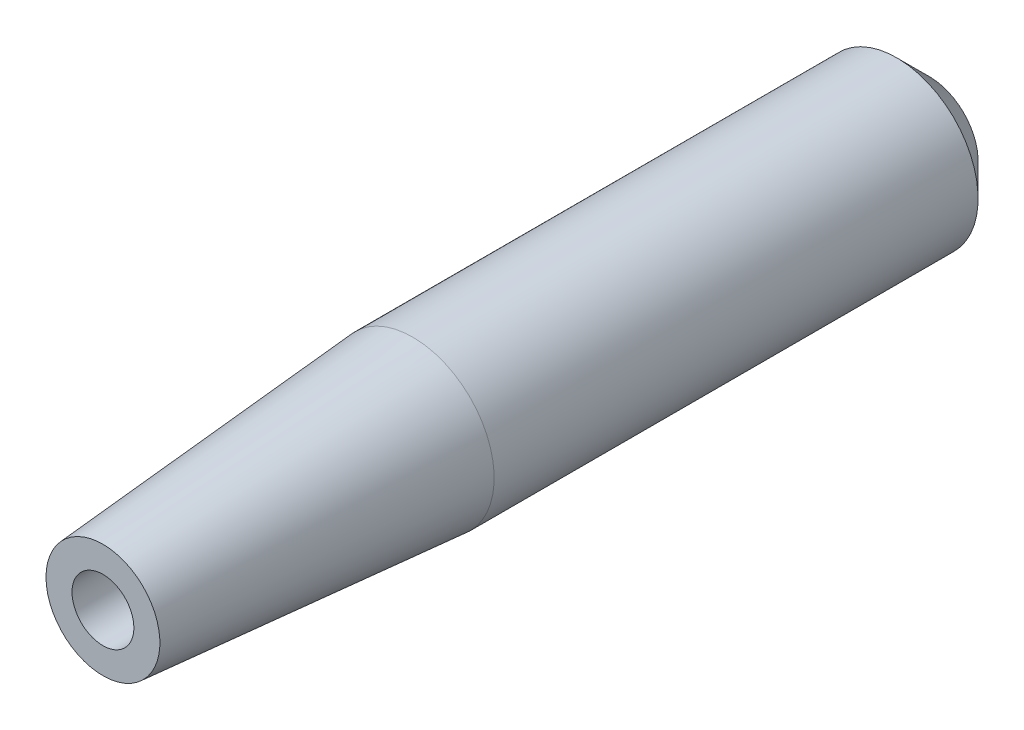
ISO-10303-21;
HEADER;
FILE_DESCRIPTION(('STEP AP214'),'2;1');
FILE_NAME('part.step','',(''),(''),'','','');
FILE_SCHEMA(('AUTOMOTIVE_DESIGN { 1 0 10303 214 1 1 1 1 }'));
ENDSEC;
DATA;
#1=APPLICATION_CONTEXT('core data for automotive mechanical design processes');
#2=APPLICATION_PROTOCOL_DEFINITION('international standard','automotive_design',2000,#1);
#3=PRODUCT_CONTEXT('',#1,'mechanical');
#4=PRODUCT('Part','Part','',(#3));
#5=PRODUCT_RELATED_PRODUCT_CATEGORY('part','',(#4));
#6=PRODUCT_DEFINITION_FORMATION('','',#4);
#7=PRODUCT_DEFINITION_CONTEXT('part definition',#1,'design');
#8=PRODUCT_DEFINITION('design','',#6,#7);
#9=PRODUCT_DEFINITION_SHAPE('','',#8);
#10=(LENGTH_UNIT() NAMED_UNIT(*) SI_UNIT(.MILLI.,.METRE.));
#11=(NAMED_UNIT(*) PLANE_ANGLE_UNIT() SI_UNIT($,.RADIAN.));
#12=(NAMED_UNIT(*) SI_UNIT($,.STERADIAN.) SOLID_ANGLE_UNIT());
#13=UNCERTAINTY_MEASURE_WITH_UNIT(LENGTH_MEASURE(1.E-05),#10,'distance_accuracy_value','');
#14=(GEOMETRIC_REPRESENTATION_CONTEXT(3) GLOBAL_UNCERTAINTY_ASSIGNED_CONTEXT((#13)) GLOBAL_UNIT_ASSIGNED_CONTEXT((#10,
#11,#12)) REPRESENTATION_CONTEXT('',''));
#15=CARTESIAN_POINT('',(0.,0.,0.));
#16=DIRECTION('',(0.,0.,1.));
#17=DIRECTION('',(1.,0.,0.));
#18=AXIS2_PLACEMENT_3D('',#15,#16,#17);
#19=CARTESIAN_POINT('',(0.,0.,-49.8));
#20=DIRECTION('',(0.,0.,1.));
#21=DIRECTION('',(1.,0.,0.));
#22=AXIS2_PLACEMENT_3D('',#19,#20,#21);
#23=CONICAL_SURFACE('',#22,4.,0.785398163397448);
#24=CARTESIAN_POINT('',(0.,0.,-48.8));
#25=DIRECTION('',(0.,0.,-1.));
#26=DIRECTION('',(1.,0.,0.));
#27=AXIS2_PLACEMENT_3D('',#24,#25,#26);
#28=CIRCLE('',#27,5.);
#29=CARTESIAN_POINT('',(-5.,0.,-48.8));
#30=VERTEX_POINT('',#29);
#31=EDGE_CURVE('E9',#30,#30,#28,.T.);
#32=ORIENTED_EDGE('',*,*,#31,.T.);
#33=EDGE_LOOP('',(#32));
#34=FACE_BOUND('',#33,.T.);
#35=CARTESIAN_POINT('',(0.,0.,-50.8));
#36=DIRECTION('',(0.,0.,-1.));
#37=DIRECTION('',(1.,0.,0.));
#38=AXIS2_PLACEMENT_3D('',#35,#36,#37);
#39=CIRCLE('',#38,3.00000004470348);
#40=CARTESIAN_POINT('',(-3.00000004470348,0.,-50.8));
#41=VERTEX_POINT('',#40);
#42=EDGE_CURVE('E50',#41,#41,#39,.T.);
#43=ORIENTED_EDGE('',*,*,#42,.F.);
#44=EDGE_LOOP('',(#43));
#45=FACE_BOUND('',#44,.T.);
#46=ADVANCED_FACE('F15',(#34,#45),#23,.T.);
#47=CARTESIAN_POINT('',(0.,0.,-34.925));
#48=DIRECTION('',(0.,0.,1.));
#49=DIRECTION('',(-1.,0.,0.));
#50=AXIS2_PLACEMENT_3D('',#47,#48,#49);
#51=CYLINDRICAL_SURFACE('',#50,5.);
#52=CARTESIAN_POINT('',(0.,0.,-19.05));
#53=DIRECTION('',(0.,0.,-1.));
#54=DIRECTION('',(1.,0.,0.));
#55=AXIS2_PLACEMENT_3D('',#52,#53,#54);
#56=CIRCLE('',#55,5.);
#57=CARTESIAN_POINT('',(-5.,0.,-19.05));
#58=VERTEX_POINT('',#57);
#59=EDGE_CURVE('E26',#58,#58,#56,.T.);
#60=ORIENTED_EDGE('',*,*,#59,.T.);
#61=EDGE_LOOP('',(#60));
#62=FACE_BOUND('',#61,.T.);
#63=ORIENTED_EDGE('',*,*,#31,.F.);
#64=EDGE_LOOP('',(#63));
#65=FACE_BOUND('',#64,.T.);
#66=ADVANCED_FACE('F89',(#62,#65),#51,.T.);
#67=CARTESIAN_POINT('',(0.,0.,-33.4000001192093));
#68=DIRECTION('',(0.,0.,1.));
#69=DIRECTION('',(-1.,0.,0.));
#70=AXIS2_PLACEMENT_3D('',#67,#68,#69);
#71=CYLINDRICAL_SURFACE('',#70,3.00000002235174);
#72=ORIENTED_EDGE('',*,*,#42,.T.);
#73=EDGE_LOOP('',(#72));
#74=FACE_BOUND('',#73,.T.);
#75=CARTESIAN_POINT('',(0.,0.,-16.0000002384186));
#76=DIRECTION('',(0.,0.,-1.));
#77=DIRECTION('',(1.,0.,0.));
#78=AXIS2_PLACEMENT_3D('',#75,#76,#77);
#79=CIRCLE('',#78,3.);
#80=CARTESIAN_POINT('',(-3.,0.,-16.0000002384186));
#81=VERTEX_POINT('',#80);
#82=EDGE_CURVE('E56',#81,#81,#79,.T.);
#83=ORIENTED_EDGE('',*,*,#82,.F.);
#84=EDGE_LOOP('',(#83));
#85=FACE_BOUND('',#84,.T.);
#86=ADVANCED_FACE('F17',(#74,#85),#71,.F.);
#87=CARTESIAN_POINT('',(-1.9,0.,-16.0000002384186));
#88=DIRECTION('',(0.,0.,-1.));
#89=DIRECTION('',(-1.,0.,0.));
#90=AXIS2_PLACEMENT_3D('',#87,#88,#89);
#91=PLANE('',#90);
#92=ORIENTED_EDGE('',*,*,#82,.T.);
#93=EDGE_LOOP('',(#92));
#94=FACE_BOUND('',#93,.T.);
#95=CARTESIAN_POINT('',(0.,0.,-16.0000002384186));
#96=DIRECTION('',(0.,0.,-1.));
#97=DIRECTION('',(1.,0.,0.));
#98=AXIS2_PLACEMENT_3D('',#95,#96,#97);
#99=CIRCLE('',#98,1.9);
#100=CARTESIAN_POINT('',(-1.9,0.,-16.0000002384186));
#101=VERTEX_POINT('',#100);
#102=EDGE_CURVE('E62',#101,#101,#99,.T.);
#103=ORIENTED_EDGE('',*,*,#102,.F.);
#104=EDGE_LOOP('',(#103));
#105=FACE_BOUND('',#104,.T.);
#106=ADVANCED_FACE('F79',(#94,#105),#91,.T.);
#107=CARTESIAN_POINT('',(0.,0.,-8.00000011920929));
#108=DIRECTION('',(0.,0.,1.));
#109=DIRECTION('',(-1.,0.,0.));
#110=AXIS2_PLACEMENT_3D('',#107,#108,#109);
#111=CYLINDRICAL_SURFACE('',#110,1.9);
#112=ORIENTED_EDGE('',*,*,#102,.T.);
#113=EDGE_LOOP('',(#112));
#114=FACE_BOUND('',#113,.T.);
#115=CARTESIAN_POINT('',(0.,0.,0.));
#116=DIRECTION('',(0.,0.,-1.));
#117=DIRECTION('',(1.,0.,0.));
#118=AXIS2_PLACEMENT_3D('',#115,#116,#117);
#119=CIRCLE('',#118,1.9);
#120=CARTESIAN_POINT('',(-1.9,0.,0.));
#121=VERTEX_POINT('',#120);
#122=EDGE_CURVE('E19',#121,#121,#119,.T.);
#123=ORIENTED_EDGE('',*,*,#122,.F.);
#124=EDGE_LOOP('',(#123));
#125=FACE_BOUND('',#124,.T.);
#126=ADVANCED_FACE('F77',(#114,#125),#111,.F.);
#127=CARTESIAN_POINT('',(-3.5,0.,0.));
#128=DIRECTION('',(0.,0.,1.));
#129=DIRECTION('',(1.,0.,0.));
#130=AXIS2_PLACEMENT_3D('',#127,#128,#129);
#131=PLANE('',#130);
#132=ORIENTED_EDGE('',*,*,#122,.T.);
#133=EDGE_LOOP('',(#132));
#134=FACE_BOUND('',#133,.T.);
#135=CARTESIAN_POINT('',(0.,0.,0.));
#136=DIRECTION('',(0.,0.,-1.));
#137=DIRECTION('',(1.,0.,0.));
#138=AXIS2_PLACEMENT_3D('',#135,#136,#137);
#139=CIRCLE('',#138,3.5);
#140=CARTESIAN_POINT('',(-3.5,0.,0.));
#141=VERTEX_POINT('',#140);
#142=EDGE_CURVE('E63',#141,#141,#139,.T.);
#143=ORIENTED_EDGE('',*,*,#142,.F.);
#144=EDGE_LOOP('',(#143));
#145=FACE_BOUND('',#144,.T.);
#146=ADVANCED_FACE('F74',(#134,#145),#131,.T.);
#147=CARTESIAN_POINT('',(0.,0.,-9.525));
#148=DIRECTION('',(0.,0.,-1.));
#149=DIRECTION('',(-1.,0.,0.));
#150=AXIS2_PLACEMENT_3D('',#147,#148,#149);
#151=CONICAL_SURFACE('',#150,4.25,0.0785780301848052);
#152=ORIENTED_EDGE('',*,*,#142,.T.);
#153=EDGE_LOOP('',(#152));
#154=FACE_BOUND('',#153,.T.);
#155=ORIENTED_EDGE('',*,*,#59,.F.);
#156=EDGE_LOOP('',(#155));
#157=FACE_BOUND('',#156,.T.);
#158=ADVANCED_FACE('F47',(#154,#157),#151,.T.);
#159=CLOSED_SHELL('',(#46,#66,#86,#106,#126,#146,#158));
#160=MANIFOLD_SOLID_BREP('B1',#159);
#161=ADVANCED_BREP_SHAPE_REPRESENTATION('',(#18,#160),#14);
#162=SHAPE_DEFINITION_REPRESENTATION(#9,#161);
ENDSEC;
END-ISO-10303-21;
